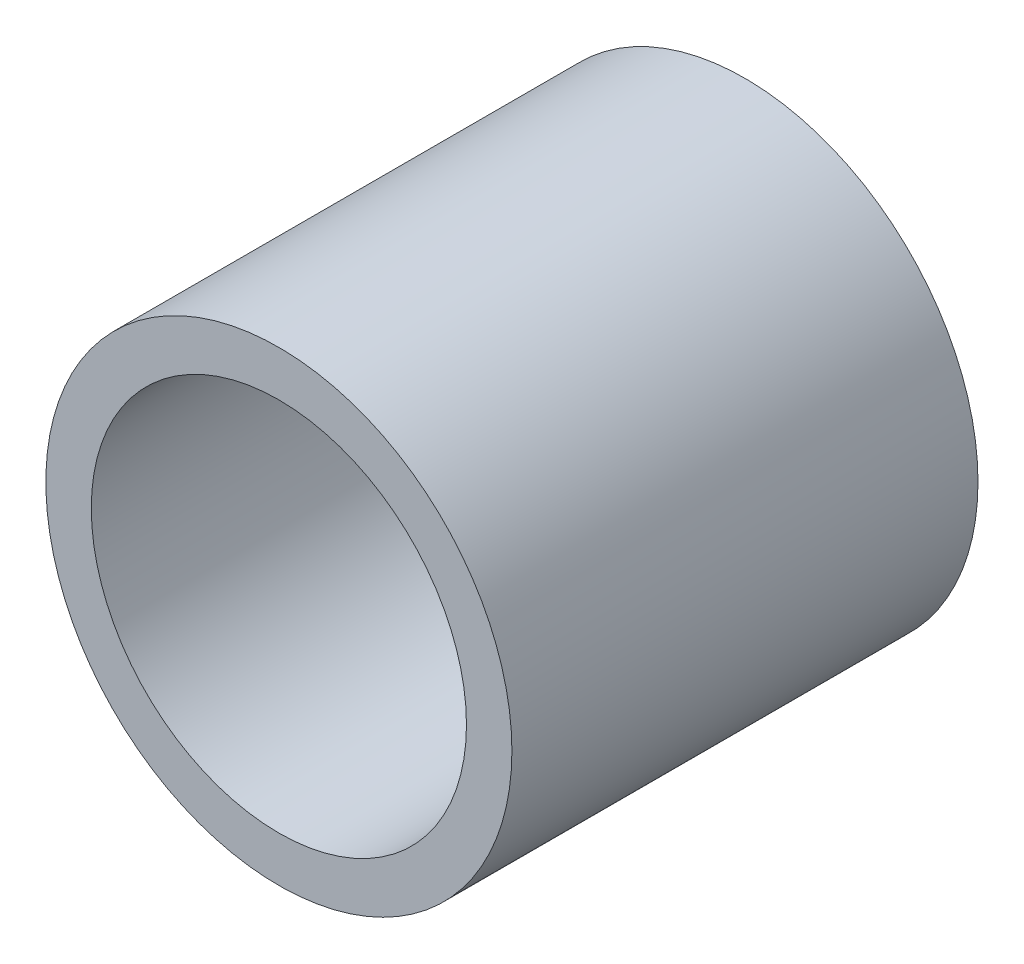
ISO-10303-21;
HEADER;
FILE_DESCRIPTION(('STEP AP214'),'2;1');
FILE_NAME('part.step','',(''),(''),'','','');
FILE_SCHEMA(('AUTOMOTIVE_DESIGN { 1 0 10303 214 1 1 1 1 }'));
ENDSEC;
DATA;
#1=APPLICATION_CONTEXT('core data for automotive mechanical design processes');
#2=APPLICATION_PROTOCOL_DEFINITION('international standard','automotive_design',2000,#1);
#3=PRODUCT_CONTEXT('',#1,'mechanical');
#4=PRODUCT('Part','Part','',(#3));
#5=PRODUCT_RELATED_PRODUCT_CATEGORY('part','',(#4));
#6=PRODUCT_DEFINITION_FORMATION('','',#4);
#7=PRODUCT_DEFINITION_CONTEXT('part definition',#1,'design');
#8=PRODUCT_DEFINITION('design','',#6,#7);
#9=PRODUCT_DEFINITION_SHAPE('','',#8);
#10=(LENGTH_UNIT() NAMED_UNIT(*) SI_UNIT(.MILLI.,.METRE.));
#11=(NAMED_UNIT(*) PLANE_ANGLE_UNIT() SI_UNIT($,.RADIAN.));
#12=(NAMED_UNIT(*) SI_UNIT($,.STERADIAN.) SOLID_ANGLE_UNIT());
#13=UNCERTAINTY_MEASURE_WITH_UNIT(LENGTH_MEASURE(1.E-05),#10,'distance_accuracy_value','');
#14=(GEOMETRIC_REPRESENTATION_CONTEXT(3) GLOBAL_UNCERTAINTY_ASSIGNED_CONTEXT((#13)) GLOBAL_UNIT_ASSIGNED_CONTEXT((#10,
#11,#12)) REPRESENTATION_CONTEXT('',''));
#15=CARTESIAN_POINT('',(0.,0.,0.));
#16=DIRECTION('',(0.,0.,1.));
#17=DIRECTION('',(1.,0.,0.));
#18=AXIS2_PLACEMENT_3D('',#15,#16,#17);
#19=CARTESIAN_POINT('',(0.,0.,10.));
#20=DIRECTION('',(0.,0.,1.));
#21=DIRECTION('',(1.,0.,0.));
#22=AXIS2_PLACEMENT_3D('',#19,#20,#21);
#23=PLANE('',#22);
#24=CARTESIAN_POINT('',(0.,0.,10.));
#25=DIRECTION('',(0.,0.,1.));
#26=DIRECTION('',(1.,0.,0.));
#27=AXIS2_PLACEMENT_3D('',#24,#25,#26);
#28=CIRCLE('',#27,5.);
#29=CARTESIAN_POINT('',(5.,0.,10.));
#30=VERTEX_POINT('',#29);
#31=EDGE_CURVE('E10',#30,#30,#28,.T.);
#32=ORIENTED_EDGE('',*,*,#31,.T.);
#33=EDGE_LOOP('',(#32));
#34=FACE_BOUND('',#33,.T.);
#35=CARTESIAN_POINT('',(0.,0.,10.));
#36=DIRECTION('',(0.,0.,1.));
#37=DIRECTION('',(1.,0.,0.));
#38=AXIS2_PLACEMENT_3D('',#35,#36,#37);
#39=CIRCLE('',#38,4.025);
#40=CARTESIAN_POINT('',(4.025,0.,10.));
#41=VERTEX_POINT('',#40);
#42=EDGE_CURVE('E41',#41,#41,#39,.T.);
#43=ORIENTED_EDGE('',*,*,#42,.F.);
#44=EDGE_LOOP('',(#43));
#45=FACE_BOUND('',#44,.T.);
#46=ADVANCED_FACE('F30',(#34,#45),#23,.T.);
#47=CARTESIAN_POINT('',(0.,0.,0.));
#48=DIRECTION('',(0.,0.,1.));
#49=DIRECTION('',(1.,0.,0.));
#50=AXIS2_PLACEMENT_3D('',#47,#48,#49);
#51=PLANE('',#50);
#52=CARTESIAN_POINT('',(0.,0.,0.));
#53=DIRECTION('',(0.,0.,1.));
#54=DIRECTION('',(1.,0.,0.));
#55=AXIS2_PLACEMENT_3D('',#52,#53,#54);
#56=CIRCLE('',#55,5.);
#57=CARTESIAN_POINT('',(5.,0.,0.));
#58=VERTEX_POINT('',#57);
#59=EDGE_CURVE('E34',#58,#58,#56,.T.);
#60=ORIENTED_EDGE('',*,*,#59,.F.);
#61=EDGE_LOOP('',(#60));
#62=FACE_BOUND('',#61,.T.);
#63=CARTESIAN_POINT('',(0.,0.,0.));
#64=DIRECTION('',(0.,0.,1.));
#65=DIRECTION('',(1.,0.,0.));
#66=AXIS2_PLACEMENT_3D('',#63,#64,#65);
#67=CIRCLE('',#66,4.025);
#68=CARTESIAN_POINT('',(4.025,0.,0.));
#69=VERTEX_POINT('',#68);
#70=EDGE_CURVE('E43',#69,#69,#67,.T.);
#71=ORIENTED_EDGE('',*,*,#70,.T.);
#72=EDGE_LOOP('',(#71));
#73=FACE_BOUND('',#72,.T.);
#74=ADVANCED_FACE('F53',(#62,#73),#51,.F.);
#75=CARTESIAN_POINT('',(0.,0.,10.));
#76=DIRECTION('',(0.,0.,-1.));
#77=DIRECTION('',(-1.,0.,0.));
#78=AXIS2_PLACEMENT_3D('',#75,#76,#77);
#79=CYLINDRICAL_SURFACE('',#78,5.);
#80=ORIENTED_EDGE('',*,*,#31,.F.);
#81=EDGE_LOOP('',(#80));
#82=FACE_BOUND('',#81,.T.);
#83=ORIENTED_EDGE('',*,*,#59,.T.);
#84=EDGE_LOOP('',(#83));
#85=FACE_BOUND('',#84,.T.);
#86=ADVANCED_FACE('F32',(#82,#85),#79,.T.);
#87=CARTESIAN_POINT('',(0.,0.,10.));
#88=DIRECTION('',(0.,0.,-1.));
#89=DIRECTION('',(-1.,0.,0.));
#90=AXIS2_PLACEMENT_3D('',#87,#88,#89);
#91=CYLINDRICAL_SURFACE('',#90,4.025);
#92=ORIENTED_EDGE('',*,*,#42,.T.);
#93=EDGE_LOOP('',(#92));
#94=FACE_BOUND('',#93,.T.);
#95=ORIENTED_EDGE('',*,*,#70,.F.);
#96=EDGE_LOOP('',(#95));
#97=FACE_BOUND('',#96,.T.);
#98=ADVANCED_FACE('F49',(#94,#97),#91,.F.);
#99=CLOSED_SHELL('',(#46,#74,#86,#98));
#100=MANIFOLD_SOLID_BREP('B2',#99);
#101=ADVANCED_BREP_SHAPE_REPRESENTATION('',(#18,#100),#14);
#102=SHAPE_DEFINITION_REPRESENTATION(#9,#101);
ENDSEC;
END-ISO-10303-21;
